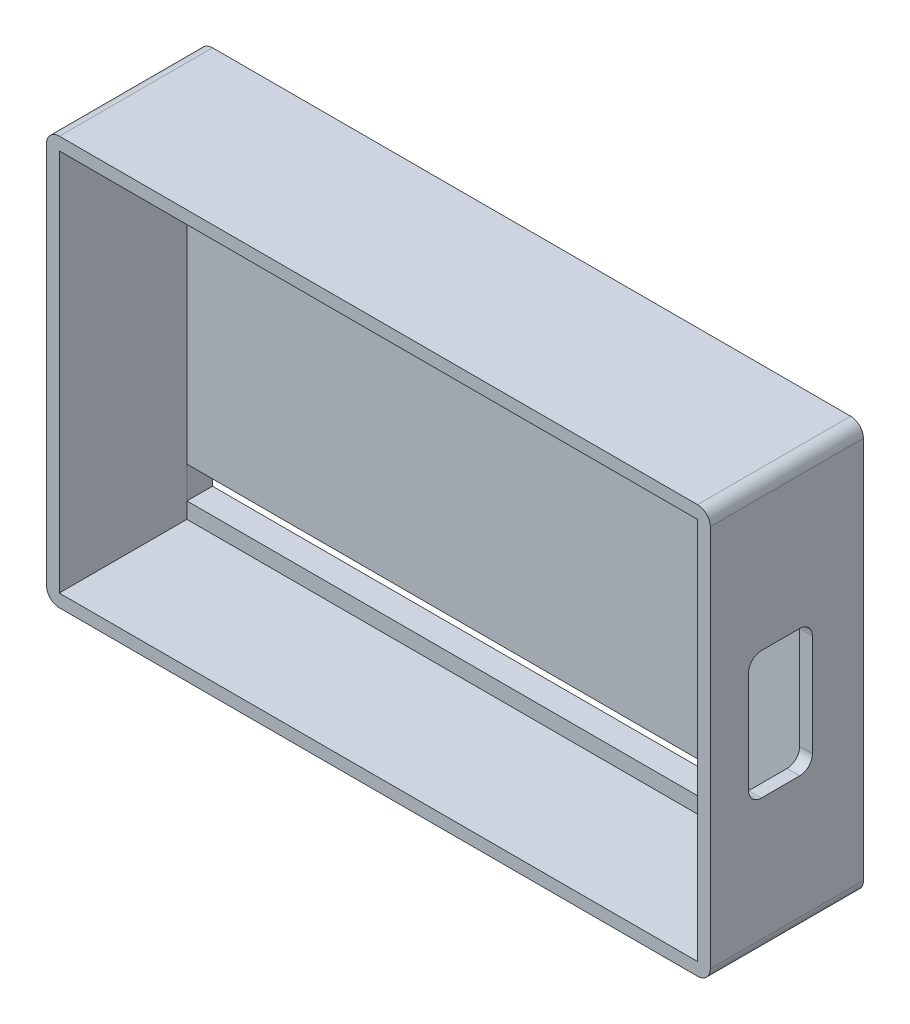
ISO-10303-21;
HEADER;
FILE_DESCRIPTION(('STEP AP214'),'2;1');
FILE_NAME('part.step','',(''),(''),'','','');
FILE_SCHEMA(('AUTOMOTIVE_DESIGN { 1 0 10303 214 1 1 1 1 }'));
ENDSEC;
DATA;
#1=APPLICATION_CONTEXT('core data for automotive mechanical design processes');
#2=APPLICATION_PROTOCOL_DEFINITION('international standard','automotive_design',2000,#1);
#3=PRODUCT_CONTEXT('',#1,'mechanical');
#4=PRODUCT('Part','Part','',(#3));
#5=PRODUCT_RELATED_PRODUCT_CATEGORY('part','',(#4));
#6=PRODUCT_DEFINITION_FORMATION('','',#4);
#7=PRODUCT_DEFINITION_CONTEXT('part definition',#1,'design');
#8=PRODUCT_DEFINITION('design','',#6,#7);
#9=PRODUCT_DEFINITION_SHAPE('','',#8);
#10=(LENGTH_UNIT() NAMED_UNIT(*) SI_UNIT(.MILLI.,.METRE.));
#11=(NAMED_UNIT(*) PLANE_ANGLE_UNIT() SI_UNIT($,.RADIAN.));
#12=(NAMED_UNIT(*) SI_UNIT($,.STERADIAN.) SOLID_ANGLE_UNIT());
#13=UNCERTAINTY_MEASURE_WITH_UNIT(LENGTH_MEASURE(1.E-05),#10,'distance_accuracy_value','');
#14=(GEOMETRIC_REPRESENTATION_CONTEXT(3) GLOBAL_UNCERTAINTY_ASSIGNED_CONTEXT((#13)) GLOBAL_UNIT_ASSIGNED_CONTEXT((#10,
#11,#12)) REPRESENTATION_CONTEXT('',''));
#15=CARTESIAN_POINT('',(0.,0.,0.));
#16=DIRECTION('',(0.,0.,1.));
#17=DIRECTION('',(1.,0.,0.));
#18=AXIS2_PLACEMENT_3D('',#15,#16,#17);
#19=CARTESIAN_POINT('',(0.,0.,2.));
#20=DIRECTION('',(0.,0.,1.));
#21=DIRECTION('',(1.,0.,0.));
#22=AXIS2_PLACEMENT_3D('',#19,#20,#21);
#23=PLANE('',#22);
#24=DIRECTION('',(-1.,0.,0.));
#25=VECTOR('',#24,1.);
#26=CARTESIAN_POINT('',(-25.,-11.25,2.));
#27=LINE('',#26,#25);
#28=CARTESIAN_POINT('',(25.0022335799357,-11.25,2.));
#29=VERTEX_POINT('',#28);
#30=CARTESIAN_POINT('',(-25.0022335799357,-11.25,2.));
#31=VERTEX_POINT('',#30);
#32=EDGE_CURVE('E562',#29,#31,#27,.T.);
#33=ORIENTED_EDGE('',*,*,#32,.F.);
#34=DIRECTION('',(0.,1.,0.));
#35=VECTOR('',#34,1.);
#36=CARTESIAN_POINT('',(25.0039671598715,0.,2.));
#37=LINE('',#36,#35);
#38=CARTESIAN_POINT('',(25.0022335799357,11.25,2.));
#39=VERTEX_POINT('',#38);
#40=EDGE_CURVE('E357',#29,#39,#37,.T.);
#41=ORIENTED_EDGE('',*,*,#40,.T.);
#42=DIRECTION('',(1.,0.,0.));
#43=VECTOR('',#42,1.);
#44=CARTESIAN_POINT('',(-25.,11.25,2.));
#45=LINE('',#44,#43);
#46=CARTESIAN_POINT('',(-25.0022335799357,11.25,2.));
#47=VERTEX_POINT('',#46);
#48=EDGE_CURVE('E523',#47,#39,#45,.T.);
#49=ORIENTED_EDGE('',*,*,#48,.F.);
#50=DIRECTION('',(0.,1.,0.));
#51=VECTOR('',#50,1.);
#52=CARTESIAN_POINT('',(-25.0039671598715,0.,2.));
#53=LINE('',#52,#51);
#54=EDGE_CURVE('E338',#47,#31,#53,.F.);
#55=ORIENTED_EDGE('',*,*,#54,.T.);
#56=EDGE_LOOP('',(#33,#41,#49,#55));
#57=FACE_BOUND('',#56,.T.);
#58=ADVANCED_FACE('F44',(#57),#23,.T.);
#59=DIRECTION('',(-1.,0.,0.));
#60=VECTOR('',#59,1.);
#61=CARTESIAN_POINT('',(-25.,13.75,2.));
#62=LINE('',#61,#60);
#63=CARTESIAN_POINT('',(25.0022335799357,13.75,2.));
#64=VERTEX_POINT('',#63);
#65=CARTESIAN_POINT('',(-25.0022335799357,13.75,2.));
#66=VERTEX_POINT('',#65);
#67=EDGE_CURVE('E528',#64,#66,#62,.T.);
#68=ORIENTED_EDGE('',*,*,#67,.F.);
#69=DIRECTION('',(0.,1.,0.));
#70=VECTOR('',#69,1.);
#71=CARTESIAN_POINT('',(25.0039671598715,0.,2.));
#72=LINE('',#71,#70);
#73=CARTESIAN_POINT('',(25.0039671598715,15.,2.));
#74=VERTEX_POINT('',#73);
#75=EDGE_CURVE('E353',#64,#74,#72,.T.);
#76=ORIENTED_EDGE('',*,*,#75,.T.);
#77=DIRECTION('',(-1.,0.,0.));
#78=VECTOR('',#77,1.);
#79=CARTESIAN_POINT('',(-25.0039671598715,15.,2.));
#80=LINE('',#79,#78);
#81=CARTESIAN_POINT('',(-25.0039671598715,15.,2.));
#82=VERTEX_POINT('',#81);
#83=EDGE_CURVE('E248',#74,#82,#80,.T.);
#84=ORIENTED_EDGE('',*,*,#83,.T.);
#85=DIRECTION('',(0.,1.,0.));
#86=VECTOR('',#85,1.);
#87=CARTESIAN_POINT('',(-25.0039671598715,0.,2.));
#88=LINE('',#87,#86);
#89=EDGE_CURVE('E348',#82,#66,#88,.F.);
#90=ORIENTED_EDGE('',*,*,#89,.T.);
#91=EDGE_LOOP('',(#68,#76,#84,#90));
#92=FACE_BOUND('',#91,.T.);
#93=ADVANCED_FACE('F638',(#92),#23,.T.);
#94=DIRECTION('',(1.,0.,0.));
#95=VECTOR('',#94,1.);
#96=CARTESIAN_POINT('',(-25.0039671598715,-15.,2.));
#97=LINE('',#96,#95);
#98=CARTESIAN_POINT('',(-25.0039671598715,-15.,2.));
#99=VERTEX_POINT('',#98);
#100=CARTESIAN_POINT('',(25.0039671598715,-15.,2.));
#101=VERTEX_POINT('',#100);
#102=EDGE_CURVE('E243',#99,#101,#97,.T.);
#103=ORIENTED_EDGE('',*,*,#102,.T.);
#104=DIRECTION('',(0.,1.,0.));
#105=VECTOR('',#104,1.);
#106=CARTESIAN_POINT('',(25.0039671598715,0.,2.));
#107=LINE('',#106,#105);
#108=CARTESIAN_POINT('',(25.0022335799357,-13.75,2.));
#109=VERTEX_POINT('',#108);
#110=EDGE_CURVE('E364',#101,#109,#107,.T.);
#111=ORIENTED_EDGE('',*,*,#110,.T.);
#112=DIRECTION('',(1.,0.,0.));
#113=VECTOR('',#112,1.);
#114=CARTESIAN_POINT('',(-25.,-13.75,2.));
#115=LINE('',#114,#113);
#116=CARTESIAN_POINT('',(-25.0022335799357,-13.75,2.));
#117=VERTEX_POINT('',#116);
#118=EDGE_CURVE('E560',#117,#109,#115,.T.);
#119=ORIENTED_EDGE('',*,*,#118,.F.);
#120=DIRECTION('',(0.,1.,0.));
#121=VECTOR('',#120,1.);
#122=CARTESIAN_POINT('',(-25.0039671598715,0.,2.));
#123=LINE('',#122,#121);
#124=EDGE_CURVE('E337',#117,#99,#123,.F.);
#125=ORIENTED_EDGE('',*,*,#124,.T.);
#126=EDGE_LOOP('',(#103,#111,#119,#125));
#127=FACE_BOUND('',#126,.T.);
#128=ADVANCED_FACE('F596',(#127),#23,.T.);
#129=CARTESIAN_POINT('',(0.,0.,0.));
#130=DIRECTION('',(0.,0.,1.));
#131=DIRECTION('',(1.,0.,0.));
#132=AXIS2_PLACEMENT_3D('',#129,#130,#131);
#133=PLANE('',#132);
#134=DIRECTION('',(0.,1.,0.));
#135=VECTOR('',#134,1.);
#136=CARTESIAN_POINT('',(25.,13.75,0.));
#137=LINE('',#136,#135);
#138=CARTESIAN_POINT('',(25.,11.25,0.));
#139=VERTEX_POINT('',#138);
#140=CARTESIAN_POINT('',(25.,13.75,0.));
#141=VERTEX_POINT('',#140);
#142=EDGE_CURVE('E547',#139,#141,#137,.T.);
#143=ORIENTED_EDGE('',*,*,#142,.T.);
#144=DIRECTION('',(-1.,0.,0.));
#145=VECTOR('',#144,1.);
#146=CARTESIAN_POINT('',(-25.,13.75,0.));
#147=LINE('',#146,#145);
#148=CARTESIAN_POINT('',(-25.,13.75,0.));
#149=VERTEX_POINT('',#148);
#150=EDGE_CURVE('E542',#141,#149,#147,.T.);
#151=ORIENTED_EDGE('',*,*,#150,.T.);
#152=DIRECTION('',(0.,-1.,0.));
#153=VECTOR('',#152,1.);
#154=CARTESIAN_POINT('',(-25.,13.75,0.));
#155=LINE('',#154,#153);
#156=CARTESIAN_POINT('',(-25.,11.25,0.));
#157=VERTEX_POINT('',#156);
#158=EDGE_CURVE('E536',#149,#157,#155,.T.);
#159=ORIENTED_EDGE('',*,*,#158,.T.);
#160=DIRECTION('',(1.,0.,0.));
#161=VECTOR('',#160,1.);
#162=CARTESIAN_POINT('',(-25.,11.25,0.));
#163=LINE('',#162,#161);
#164=EDGE_CURVE('E537',#157,#139,#163,.T.);
#165=ORIENTED_EDGE('',*,*,#164,.T.);
#166=EDGE_LOOP('',(#143,#151,#159,#165));
#167=FACE_BOUND('',#166,.T.);
#168=DIRECTION('',(0.,-1.,0.));
#169=VECTOR('',#168,1.);
#170=CARTESIAN_POINT('',(-26.,16.,0.));
#171=LINE('',#170,#169);
#172=CARTESIAN_POINT('',(-26.,15.,0.));
#173=VERTEX_POINT('',#172);
#174=CARTESIAN_POINT('',(-26.,-15.,0.));
#175=VERTEX_POINT('',#174);
#176=EDGE_CURVE('E500',#173,#175,#171,.T.);
#177=ORIENTED_EDGE('',*,*,#176,.F.);
#178=CARTESIAN_POINT('',(-25.,15.,0.));
#179=DIRECTION('',(0.,0.,1.));
#180=DIRECTION('',(1.,0.,0.));
#181=AXIS2_PLACEMENT_3D('',#178,#179,#180);
#182=CIRCLE('',#181,1.);
#183=CARTESIAN_POINT('',(-25.,16.,0.));
#184=VERTEX_POINT('',#183);
#185=EDGE_CURVE('E440',#173,#184,#182,.F.);
#186=ORIENTED_EDGE('',*,*,#185,.T.);
#187=DIRECTION('',(-1.,0.,0.));
#188=VECTOR('',#187,1.);
#189=CARTESIAN_POINT('',(-26.,16.,0.));
#190=LINE('',#189,#188);
#191=CARTESIAN_POINT('',(25.,16.,0.));
#192=VERTEX_POINT('',#191);
#193=EDGE_CURVE('E499',#192,#184,#190,.T.);
#194=ORIENTED_EDGE('',*,*,#193,.F.);
#195=CARTESIAN_POINT('',(25.,15.,0.));
#196=DIRECTION('',(0.,0.,1.));
#197=DIRECTION('',(1.,0.,0.));
#198=AXIS2_PLACEMENT_3D('',#195,#196,#197);
#199=CIRCLE('',#198,1.);
#200=CARTESIAN_POINT('',(26.,15.,0.));
#201=VERTEX_POINT('',#200);
#202=EDGE_CURVE('E394',#192,#201,#199,.F.);
#203=ORIENTED_EDGE('',*,*,#202,.T.);
#204=DIRECTION('',(0.,1.,0.));
#205=VECTOR('',#204,1.);
#206=CARTESIAN_POINT('',(26.,16.,0.));
#207=LINE('',#206,#205);
#208=CARTESIAN_POINT('',(26.,-15.,0.));
#209=VERTEX_POINT('',#208);
#210=EDGE_CURVE('E502',#209,#201,#207,.T.);
#211=ORIENTED_EDGE('',*,*,#210,.F.);
#212=CARTESIAN_POINT('',(25.,-15.,0.));
#213=DIRECTION('',(0.,0.,1.));
#214=DIRECTION('',(1.,0.,0.));
#215=AXIS2_PLACEMENT_3D('',#212,#213,#214);
#216=CIRCLE('',#215,1.);
#217=CARTESIAN_POINT('',(25.,-16.,0.));
#218=VERTEX_POINT('',#217);
#219=EDGE_CURVE('E410',#209,#218,#216,.F.);
#220=ORIENTED_EDGE('',*,*,#219,.T.);
#221=DIRECTION('',(1.,0.,0.));
#222=VECTOR('',#221,1.);
#223=CARTESIAN_POINT('',(-26.,-16.,0.));
#224=LINE('',#223,#222);
#225=CARTESIAN_POINT('',(-25.,-16.,0.));
#226=VERTEX_POINT('',#225);
#227=EDGE_CURVE('E376',#226,#218,#224,.T.);
#228=ORIENTED_EDGE('',*,*,#227,.F.);
#229=CARTESIAN_POINT('',(-25.,-15.,0.));
#230=DIRECTION('',(0.,0.,1.));
#231=DIRECTION('',(1.,0.,0.));
#232=AXIS2_PLACEMENT_3D('',#229,#230,#231);
#233=CIRCLE('',#232,1.);
#234=EDGE_CURVE('E422',#226,#175,#233,.F.);
#235=ORIENTED_EDGE('',*,*,#234,.T.);
#236=EDGE_LOOP('',(#177,#186,#194,#203,#211,#220,#228,#235));
#237=FACE_BOUND('',#236,.T.);
#238=DIRECTION('',(0.,1.,0.));
#239=VECTOR('',#238,1.);
#240=CARTESIAN_POINT('',(25.,-11.25,0.));
#241=LINE('',#240,#239);
#242=CARTESIAN_POINT('',(25.,-13.75,0.));
#243=VERTEX_POINT('',#242);
#244=CARTESIAN_POINT('',(25.,-11.25,0.));
#245=VERTEX_POINT('',#244);
#246=EDGE_CURVE('E276',#243,#245,#241,.T.);
#247=ORIENTED_EDGE('',*,*,#246,.T.);
#248=DIRECTION('',(-1.,0.,0.));
#249=VECTOR('',#248,1.);
#250=CARTESIAN_POINT('',(-25.,-11.25,0.));
#251=LINE('',#250,#249);
#252=CARTESIAN_POINT('',(-25.,-11.25,0.));
#253=VERTEX_POINT('',#252);
#254=EDGE_CURVE('E579',#245,#253,#251,.T.);
#255=ORIENTED_EDGE('',*,*,#254,.T.);
#256=DIRECTION('',(0.,-1.,0.));
#257=VECTOR('',#256,1.);
#258=CARTESIAN_POINT('',(-25.,-11.25,0.));
#259=LINE('',#258,#257);
#260=CARTESIAN_POINT('',(-25.,-13.75,0.));
#261=VERTEX_POINT('',#260);
#262=EDGE_CURVE('E573',#253,#261,#259,.T.);
#263=ORIENTED_EDGE('',*,*,#262,.T.);
#264=DIRECTION('',(1.,0.,0.));
#265=VECTOR('',#264,1.);
#266=CARTESIAN_POINT('',(-25.,-13.75,0.));
#267=LINE('',#266,#265);
#268=EDGE_CURVE('E571',#261,#243,#267,.T.);
#269=ORIENTED_EDGE('',*,*,#268,.T.);
#270=EDGE_LOOP('',(#247,#255,#263,#269));
#271=FACE_BOUND('',#270,.T.);
#272=ADVANCED_FACE('F648',(#167,#237,#271),#133,.F.);
#273=CARTESIAN_POINT('',(26.,16.,2.));
#274=DIRECTION('',(-1.,0.,0.));
#275=DIRECTION('',(0.,0.,1.));
#276=AXIS2_PLACEMENT_3D('',#273,#274,#275);
#277=PLANE('',#276);
#278=DIRECTION('',(0.,0.,1.));
#279=VECTOR('',#278,1.);
#280=CARTESIAN_POINT('',(26.,4.59367110958419,9.));
#281=LINE('',#280,#279);
#282=CARTESIAN_POINT('',(26.,4.59367110958419,5.));
#283=VERTEX_POINT('',#282);
#284=CARTESIAN_POINT('',(26.,4.59367110958419,8.));
#285=VERTEX_POINT('',#284);
#286=EDGE_CURVE('E724',#283,#285,#281,.T.);
#287=ORIENTED_EDGE('',*,*,#286,.F.);
#288=CARTESIAN_POINT('',(26.,3.59367110958419,5.));
#289=DIRECTION('',(-1.,0.,0.));
#290=DIRECTION('',(0.,0.,1.));
#291=AXIS2_PLACEMENT_3D('',#288,#289,#290);
#292=CIRCLE('',#291,1.);
#293=CARTESIAN_POINT('',(26.,3.59367110958419,4.));
#294=VERTEX_POINT('',#293);
#295=EDGE_CURVE('E454',#283,#294,#292,.T.);
#296=ORIENTED_EDGE('',*,*,#295,.T.);
#297=DIRECTION('',(0.,1.,0.));
#298=VECTOR('',#297,1.);
#299=CARTESIAN_POINT('',(26.,4.59367110958419,4.));
#300=LINE('',#299,#298);
#301=CARTESIAN_POINT('',(26.,-4.40632889041581,4.));
#302=VERTEX_POINT('',#301);
#303=EDGE_CURVE('E718',#302,#294,#300,.T.);
#304=ORIENTED_EDGE('',*,*,#303,.F.);
#305=CARTESIAN_POINT('',(26.,-4.40632889041581,5.));
#306=DIRECTION('',(-1.,0.,0.));
#307=DIRECTION('',(0.,0.,1.));
#308=AXIS2_PLACEMENT_3D('',#305,#306,#307);
#309=CIRCLE('',#308,1.);
#310=CARTESIAN_POINT('',(26.,-5.40632889041581,5.));
#311=VERTEX_POINT('',#310);
#312=EDGE_CURVE('E466',#302,#311,#309,.T.);
#313=ORIENTED_EDGE('',*,*,#312,.T.);
#314=DIRECTION('',(0.,0.,-1.));
#315=VECTOR('',#314,1.);
#316=CARTESIAN_POINT('',(26.,-5.40632889041581,9.));
#317=LINE('',#316,#315);
#318=CARTESIAN_POINT('',(26.,-5.40632889041581,8.));
#319=VERTEX_POINT('',#318);
#320=EDGE_CURVE('E356',#319,#311,#317,.T.);
#321=ORIENTED_EDGE('',*,*,#320,.F.);
#322=CARTESIAN_POINT('',(26.,-4.40632889041581,8.));
#323=DIRECTION('',(-1.,0.,0.));
#324=DIRECTION('',(0.,0.,1.));
#325=AXIS2_PLACEMENT_3D('',#322,#323,#324);
#326=CIRCLE('',#325,1.);
#327=CARTESIAN_POINT('',(26.,-4.40632889041581,9.));
#328=VERTEX_POINT('',#327);
#329=EDGE_CURVE('E482',#319,#328,#326,.T.);
#330=ORIENTED_EDGE('',*,*,#329,.T.);
#331=DIRECTION('',(0.,-1.,0.));
#332=VECTOR('',#331,1.);
#333=CARTESIAN_POINT('',(26.,4.59367110958419,9.));
#334=LINE('',#333,#332);
#335=CARTESIAN_POINT('',(26.,3.59367110958419,9.));
#336=VERTEX_POINT('',#335);
#337=EDGE_CURVE('E716',#336,#328,#334,.T.);
#338=ORIENTED_EDGE('',*,*,#337,.F.);
#339=CARTESIAN_POINT('',(26.,3.59367110958419,8.));
#340=DIRECTION('',(-1.,0.,0.));
#341=DIRECTION('',(0.,0.,1.));
#342=AXIS2_PLACEMENT_3D('',#339,#340,#341);
#343=CIRCLE('',#342,1.);
#344=EDGE_CURVE('E53',#336,#285,#343,.T.);
#345=ORIENTED_EDGE('',*,*,#344,.T.);
#346=EDGE_LOOP('',(#287,#296,#304,#313,#321,#330,#338,#345));
#347=FACE_BOUND('',#346,.T.);
#348=DIRECTION('',(0.,1.,0.));
#349=VECTOR('',#348,1.);
#350=CARTESIAN_POINT('',(26.,16.,12.));
#351=LINE('',#350,#349);
#352=CARTESIAN_POINT('',(26.,-15.,12.));
#353=VERTEX_POINT('',#352);
#354=CARTESIAN_POINT('',(26.,15.,12.));
#355=VERTEX_POINT('',#354);
#356=EDGE_CURVE('E252',#353,#355,#351,.T.);
#357=ORIENTED_EDGE('',*,*,#356,.F.);
#358=DIRECTION('',(0.,0.,-1.));
#359=VECTOR('',#358,1.);
#360=CARTESIAN_POINT('',(26.,-15.,2.));
#361=LINE('',#360,#359);
#362=EDGE_CURVE('E401',#353,#209,#361,.T.);
#363=ORIENTED_EDGE('',*,*,#362,.T.);
#364=ORIENTED_EDGE('',*,*,#210,.T.);
#365=DIRECTION('',(0.,0.,-1.));
#366=VECTOR('',#365,1.);
#367=CARTESIAN_POINT('',(26.,15.,2.));
#368=LINE('',#367,#366);
#369=EDGE_CURVE('E396',#201,#355,#368,.F.);
#370=ORIENTED_EDGE('',*,*,#369,.T.);
#371=EDGE_LOOP('',(#357,#363,#364,#370));
#372=FACE_BOUND('',#371,.T.);
#373=ADVANCED_FACE('F651',(#347,#372),#277,.F.);
#374=CARTESIAN_POINT('',(-26.,16.,2.));
#375=DIRECTION('',(0.,-1.,0.));
#376=DIRECTION('',(0.,0.,-1.));
#377=AXIS2_PLACEMENT_3D('',#374,#375,#376);
#378=PLANE('',#377);
#379=ORIENTED_EDGE('',*,*,#193,.T.);
#380=DIRECTION('',(0.,0.,-1.));
#381=VECTOR('',#380,1.);
#382=CARTESIAN_POINT('',(-25.,16.,2.));
#383=LINE('',#382,#381);
#384=CARTESIAN_POINT('',(-25.,16.,12.));
#385=VERTEX_POINT('',#384);
#386=EDGE_CURVE('E439',#184,#385,#383,.F.);
#387=ORIENTED_EDGE('',*,*,#386,.T.);
#388=DIRECTION('',(-1.,0.,0.));
#389=VECTOR('',#388,1.);
#390=CARTESIAN_POINT('',(-26.,16.,12.));
#391=LINE('',#390,#389);
#392=CARTESIAN_POINT('',(25.,16.,12.));
#393=VERTEX_POINT('',#392);
#394=EDGE_CURVE('E268',#393,#385,#391,.T.);
#395=ORIENTED_EDGE('',*,*,#394,.F.);
#396=DIRECTION('',(0.,0.,-1.));
#397=VECTOR('',#396,1.);
#398=CARTESIAN_POINT('',(25.,16.,2.));
#399=LINE('',#398,#397);
#400=EDGE_CURVE('E389',#393,#192,#399,.T.);
#401=ORIENTED_EDGE('',*,*,#400,.T.);
#402=EDGE_LOOP('',(#379,#387,#395,#401));
#403=FACE_BOUND('',#402,.T.);
#404=ADVANCED_FACE('F665',(#403),#378,.F.);
#405=CARTESIAN_POINT('',(-26.,16.,2.));
#406=DIRECTION('',(1.,0.,0.));
#407=DIRECTION('',(0.,0.,-1.));
#408=AXIS2_PLACEMENT_3D('',#405,#406,#407);
#409=PLANE('',#408);
#410=DIRECTION('',(0.,-1.,0.));
#411=VECTOR('',#410,1.);
#412=CARTESIAN_POINT('',(-26.,16.,12.));
#413=LINE('',#412,#411);
#414=CARTESIAN_POINT('',(-26.,15.,12.));
#415=VERTEX_POINT('',#414);
#416=CARTESIAN_POINT('',(-26.,-15.,12.));
#417=VERTEX_POINT('',#416);
#418=EDGE_CURVE('E271',#415,#417,#413,.T.);
#419=ORIENTED_EDGE('',*,*,#418,.F.);
#420=DIRECTION('',(0.,0.,-1.));
#421=VECTOR('',#420,1.);
#422=CARTESIAN_POINT('',(-26.,15.,2.));
#423=LINE('',#422,#421);
#424=EDGE_CURVE('E433',#415,#173,#423,.T.);
#425=ORIENTED_EDGE('',*,*,#424,.T.);
#426=ORIENTED_EDGE('',*,*,#176,.T.);
#427=DIRECTION('',(0.,0.,-1.));
#428=VECTOR('',#427,1.);
#429=CARTESIAN_POINT('',(-26.,-15.,2.));
#430=LINE('',#429,#428);
#431=EDGE_CURVE('E428',#175,#417,#430,.F.);
#432=ORIENTED_EDGE('',*,*,#431,.T.);
#433=EDGE_LOOP('',(#419,#425,#426,#432));
#434=FACE_BOUND('',#433,.T.);
#435=ADVANCED_FACE('F668',(#434),#409,.F.);
#436=CARTESIAN_POINT('',(-26.,-16.,2.));
#437=DIRECTION('',(0.,1.,0.));
#438=DIRECTION('',(0.,0.,1.));
#439=AXIS2_PLACEMENT_3D('',#436,#437,#438);
#440=PLANE('',#439);
#441=DIRECTION('',(1.,0.,0.));
#442=VECTOR('',#441,1.);
#443=CARTESIAN_POINT('',(-26.,-16.,12.));
#444=LINE('',#443,#442);
#445=CARTESIAN_POINT('',(-25.,-16.,12.));
#446=VERTEX_POINT('',#445);
#447=CARTESIAN_POINT('',(25.,-16.,12.));
#448=VERTEX_POINT('',#447);
#449=EDGE_CURVE('E277',#446,#448,#444,.T.);
#450=ORIENTED_EDGE('',*,*,#449,.F.);
#451=DIRECTION('',(0.,0.,-1.));
#452=VECTOR('',#451,1.);
#453=CARTESIAN_POINT('',(-25.,-16.,2.));
#454=LINE('',#453,#452);
#455=EDGE_CURVE('E419',#446,#226,#454,.T.);
#456=ORIENTED_EDGE('',*,*,#455,.T.);
#457=ORIENTED_EDGE('',*,*,#227,.T.);
#458=DIRECTION('',(0.,0.,-1.));
#459=VECTOR('',#458,1.);
#460=CARTESIAN_POINT('',(25.,-16.,2.));
#461=LINE('',#460,#459);
#462=EDGE_CURVE('E413',#218,#448,#461,.F.);
#463=ORIENTED_EDGE('',*,*,#462,.T.);
#464=EDGE_LOOP('',(#450,#456,#457,#463));
#465=FACE_BOUND('',#464,.T.);
#466=ADVANCED_FACE('F667',(#465),#440,.F.);
#467=CARTESIAN_POINT('',(25.,13.75,2.));
#468=DIRECTION('',(-1.,0.,0.));
#469=DIRECTION('',(0.,0.,1.));
#470=AXIS2_PLACEMENT_3D('',#467,#468,#469);
#471=PLANE('',#470);
#472=ORIENTED_EDGE('',*,*,#142,.F.);
#473=DIRECTION('',(0.,0.,-1.));
#474=VECTOR('',#473,1.);
#475=CARTESIAN_POINT('',(25.,11.25,2.));
#476=LINE('',#475,#474);
#477=EDGE_CURVE('E520',#39,#139,#476,.T.);
#478=ORIENTED_EDGE('',*,*,#477,.F.);
#479=CARTESIAN_POINT('',(25.,11.25,2.));
#480=DIRECTION('',(0.,1.,0.));
#481=VECTOR('',#480,1.);
#482=LINE('',#479,#481);
#483=EDGE_CURVE('E535',#39,#64,#482,.T.);
#484=ORIENTED_EDGE('',*,*,#483,.T.);
#485=DIRECTION('',(0.,0.,-1.));
#486=VECTOR('',#485,1.);
#487=CARTESIAN_POINT('',(25.,13.75,2.));
#488=LINE('',#487,#486);
#489=EDGE_CURVE('E510',#64,#141,#488,.T.);
#490=ORIENTED_EDGE('',*,*,#489,.T.);
#491=EDGE_LOOP('',(#472,#478,#484,#490));
#492=FACE_BOUND('',#491,.T.);
#493=ADVANCED_FACE('F666',(#492),#471,.T.);
#494=CARTESIAN_POINT('',(-25.,13.75,2.));
#495=DIRECTION('',(0.,-1.,0.));
#496=DIRECTION('',(0.,0.,-1.));
#497=AXIS2_PLACEMENT_3D('',#494,#495,#496);
#498=PLANE('',#497);
#499=ORIENTED_EDGE('',*,*,#150,.F.);
#500=ORIENTED_EDGE('',*,*,#489,.F.);
#501=ORIENTED_EDGE('',*,*,#67,.T.);
#502=DIRECTION('',(0.,0.,-1.));
#503=VECTOR('',#502,1.);
#504=CARTESIAN_POINT('',(-25.,13.75,2.));
#505=LINE('',#504,#503);
#506=EDGE_CURVE('E512',#66,#149,#505,.T.);
#507=ORIENTED_EDGE('',*,*,#506,.T.);
#508=EDGE_LOOP('',(#499,#500,#501,#507));
#509=FACE_BOUND('',#508,.T.);
#510=ADVANCED_FACE('F810',(#509),#498,.T.);
#511=CARTESIAN_POINT('',(-25.,13.75,2.));
#512=DIRECTION('',(1.,0.,0.));
#513=DIRECTION('',(0.,1.,0.));
#514=AXIS2_PLACEMENT_3D('',#511,#512,#513);
#515=PLANE('',#514);
#516=ORIENTED_EDGE('',*,*,#158,.F.);
#517=ORIENTED_EDGE('',*,*,#506,.F.);
#518=CARTESIAN_POINT('',(-25.,13.75,2.));
#519=DIRECTION('',(0.,-1.,0.));
#520=VECTOR('',#519,1.);
#521=LINE('',#518,#520);
#522=EDGE_CURVE('E521',#66,#47,#521,.T.);
#523=ORIENTED_EDGE('',*,*,#522,.T.);
#524=DIRECTION('',(0.,0.,-1.));
#525=VECTOR('',#524,1.);
#526=CARTESIAN_POINT('',(-25.,11.25,2.));
#527=LINE('',#526,#525);
#528=EDGE_CURVE('E511',#47,#157,#527,.T.);
#529=ORIENTED_EDGE('',*,*,#528,.T.);
#530=EDGE_LOOP('',(#516,#517,#523,#529));
#531=FACE_BOUND('',#530,.T.);
#532=ADVANCED_FACE('F775',(#531),#515,.T.);
#533=CARTESIAN_POINT('',(-25.,11.25,2.));
#534=DIRECTION('',(0.,1.,0.));
#535=DIRECTION('',(0.,0.,1.));
#536=AXIS2_PLACEMENT_3D('',#533,#534,#535);
#537=PLANE('',#536);
#538=ORIENTED_EDGE('',*,*,#164,.F.);
#539=ORIENTED_EDGE('',*,*,#528,.F.);
#540=ORIENTED_EDGE('',*,*,#48,.T.);
#541=ORIENTED_EDGE('',*,*,#477,.T.);
#542=EDGE_LOOP('',(#538,#539,#540,#541));
#543=FACE_BOUND('',#542,.T.);
#544=ADVANCED_FACE('F767',(#543),#537,.T.);
#545=CARTESIAN_POINT('',(25.,-11.25,2.));
#546=DIRECTION('',(-1.,0.,0.));
#547=DIRECTION('',(0.,-1.,0.));
#548=AXIS2_PLACEMENT_3D('',#545,#546,#547);
#549=PLANE('',#548);
#550=ORIENTED_EDGE('',*,*,#246,.F.);
#551=DIRECTION('',(0.,0.,-1.));
#552=VECTOR('',#551,1.);
#553=CARTESIAN_POINT('',(25.,-13.75,2.));
#554=LINE('',#553,#552);
#555=EDGE_CURVE('E334',#109,#243,#554,.T.);
#556=ORIENTED_EDGE('',*,*,#555,.F.);
#557=CARTESIAN_POINT('',(25.,-13.75,2.));
#558=DIRECTION('',(0.,1.,0.));
#559=VECTOR('',#558,1.);
#560=LINE('',#557,#559);
#561=EDGE_CURVE('E570',#109,#29,#560,.T.);
#562=ORIENTED_EDGE('',*,*,#561,.T.);
#563=DIRECTION('',(0.,0.,-1.));
#564=VECTOR('',#563,1.);
#565=CARTESIAN_POINT('',(25.,-11.25,2.));
#566=LINE('',#565,#564);
#567=EDGE_CURVE('E329',#29,#245,#566,.T.);
#568=ORIENTED_EDGE('',*,*,#567,.T.);
#569=EDGE_LOOP('',(#550,#556,#562,#568));
#570=FACE_BOUND('',#569,.T.);
#571=ADVANCED_FACE('F754',(#570),#549,.T.);
#572=CARTESIAN_POINT('',(-25.,-11.25,2.));
#573=DIRECTION('',(0.,-1.,0.));
#574=DIRECTION('',(0.,0.,-1.));
#575=AXIS2_PLACEMENT_3D('',#572,#573,#574);
#576=PLANE('',#575);
#577=ORIENTED_EDGE('',*,*,#254,.F.);
#578=ORIENTED_EDGE('',*,*,#567,.F.);
#579=ORIENTED_EDGE('',*,*,#32,.T.);
#580=DIRECTION('',(0.,0.,-1.));
#581=VECTOR('',#580,1.);
#582=CARTESIAN_POINT('',(-25.,-11.25,2.));
#583=LINE('',#582,#581);
#584=EDGE_CURVE('E316',#31,#253,#583,.T.);
#585=ORIENTED_EDGE('',*,*,#584,.T.);
#586=EDGE_LOOP('',(#577,#578,#579,#585));
#587=FACE_BOUND('',#586,.T.);
#588=ADVANCED_FACE('F307',(#587),#576,.T.);
#589=CARTESIAN_POINT('',(-25.,-11.25,2.));
#590=DIRECTION('',(1.,0.,0.));
#591=DIRECTION('',(0.,0.,-1.));
#592=AXIS2_PLACEMENT_3D('',#589,#590,#591);
#593=PLANE('',#592);
#594=ORIENTED_EDGE('',*,*,#262,.F.);
#595=ORIENTED_EDGE('',*,*,#584,.F.);
#596=CARTESIAN_POINT('',(-25.,-11.25,2.));
#597=DIRECTION('',(0.,-1.,0.));
#598=VECTOR('',#597,1.);
#599=LINE('',#596,#598);
#600=EDGE_CURVE('E561',#31,#117,#599,.T.);
#601=ORIENTED_EDGE('',*,*,#600,.T.);
#602=DIRECTION('',(0.,0.,-1.));
#603=VECTOR('',#602,1.);
#604=CARTESIAN_POINT('',(-25.,-13.75,2.));
#605=LINE('',#604,#603);
#606=EDGE_CURVE('E327',#117,#261,#605,.T.);
#607=ORIENTED_EDGE('',*,*,#606,.T.);
#608=EDGE_LOOP('',(#594,#595,#601,#607));
#609=FACE_BOUND('',#608,.T.);
#610=ADVANCED_FACE('F302',(#609),#593,.T.);
#611=CARTESIAN_POINT('',(-25.,-13.75,2.));
#612=DIRECTION('',(0.,1.,0.));
#613=DIRECTION('',(0.,0.,1.));
#614=AXIS2_PLACEMENT_3D('',#611,#612,#613);
#615=PLANE('',#614);
#616=ORIENTED_EDGE('',*,*,#268,.F.);
#617=ORIENTED_EDGE('',*,*,#606,.F.);
#618=ORIENTED_EDGE('',*,*,#118,.T.);
#619=ORIENTED_EDGE('',*,*,#555,.T.);
#620=EDGE_LOOP('',(#616,#617,#618,#619));
#621=FACE_BOUND('',#620,.T.);
#622=ADVANCED_FACE('F297',(#621),#615,.T.);
#623=CARTESIAN_POINT('',(0.,0.,12.));
#624=DIRECTION('',(0.,0.,1.));
#625=DIRECTION('',(1.,0.,0.));
#626=AXIS2_PLACEMENT_3D('',#623,#624,#625);
#627=PLANE('',#626);
#628=ORIENTED_EDGE('',*,*,#394,.T.);
#629=CARTESIAN_POINT('',(-25.,15.,12.));
#630=DIRECTION('',(0.,0.,1.));
#631=DIRECTION('',(1.,0.,0.));
#632=AXIS2_PLACEMENT_3D('',#629,#630,#631);
#633=CIRCLE('',#632,1.);
#634=EDGE_CURVE('E442',#385,#415,#633,.T.);
#635=ORIENTED_EDGE('',*,*,#634,.T.);
#636=ORIENTED_EDGE('',*,*,#418,.T.);
#637=CARTESIAN_POINT('',(-25.,-15.,12.));
#638=DIRECTION('',(0.,0.,1.));
#639=DIRECTION('',(1.,0.,0.));
#640=AXIS2_PLACEMENT_3D('',#637,#638,#639);
#641=CIRCLE('',#640,1.);
#642=EDGE_CURVE('E427',#417,#446,#641,.T.);
#643=ORIENTED_EDGE('',*,*,#642,.T.);
#644=ORIENTED_EDGE('',*,*,#449,.T.);
#645=CARTESIAN_POINT('',(25.,-15.,12.));
#646=DIRECTION('',(0.,0.,1.));
#647=DIRECTION('',(1.,0.,0.));
#648=AXIS2_PLACEMENT_3D('',#645,#646,#647);
#649=CIRCLE('',#648,1.);
#650=EDGE_CURVE('E411',#448,#353,#649,.T.);
#651=ORIENTED_EDGE('',*,*,#650,.T.);
#652=ORIENTED_EDGE('',*,*,#356,.T.);
#653=CARTESIAN_POINT('',(25.,15.,12.));
#654=DIRECTION('',(0.,0.,1.));
#655=DIRECTION('',(1.,0.,0.));
#656=AXIS2_PLACEMENT_3D('',#653,#654,#655);
#657=CIRCLE('',#656,1.);
#658=EDGE_CURVE('E400',#355,#393,#657,.T.);
#659=ORIENTED_EDGE('',*,*,#658,.T.);
#660=EDGE_LOOP('',(#628,#635,#636,#643,#644,#651,#652,#659));
#661=FACE_BOUND('',#660,.T.);
#662=DIRECTION('',(-1.,0.,0.));
#663=VECTOR('',#662,1.);
#664=CARTESIAN_POINT('',(-25.0039671598715,15.,12.));
#665=LINE('',#664,#663);
#666=CARTESIAN_POINT('',(25.0039671598715,15.,12.));
#667=VERTEX_POINT('',#666);
#668=CARTESIAN_POINT('',(-25.0039671598715,15.,12.));
#669=VERTEX_POINT('',#668);
#670=EDGE_CURVE('E245',#667,#669,#665,.T.);
#671=ORIENTED_EDGE('',*,*,#670,.F.);
#672=DIRECTION('',(0.,1.,0.));
#673=VECTOR('',#672,1.);
#674=CARTESIAN_POINT('',(25.0039671598715,15.,12.));
#675=LINE('',#674,#673);
#676=CARTESIAN_POINT('',(25.0039671598715,-15.,12.));
#677=VERTEX_POINT('',#676);
#678=EDGE_CURVE('E233',#677,#667,#675,.T.);
#679=ORIENTED_EDGE('',*,*,#678,.F.);
#680=DIRECTION('',(1.,0.,0.));
#681=VECTOR('',#680,1.);
#682=CARTESIAN_POINT('',(-25.0039671598715,-15.,12.));
#683=LINE('',#682,#681);
#684=CARTESIAN_POINT('',(-25.0039671598715,-15.,12.));
#685=VERTEX_POINT('',#684);
#686=EDGE_CURVE('E263',#685,#677,#683,.T.);
#687=ORIENTED_EDGE('',*,*,#686,.F.);
#688=DIRECTION('',(0.,-1.,0.));
#689=VECTOR('',#688,1.);
#690=CARTESIAN_POINT('',(-25.0039671598715,15.,12.));
#691=LINE('',#690,#689);
#692=EDGE_CURVE('E260',#669,#685,#691,.T.);
#693=ORIENTED_EDGE('',*,*,#692,.F.);
#694=EDGE_LOOP('',(#671,#679,#687,#693));
#695=FACE_BOUND('',#694,.T.);
#696=ADVANCED_FACE('F253',(#661,#695),#627,.T.);
#697=CARTESIAN_POINT('',(25.0039671598715,15.,12.));
#698=DIRECTION('',(-1.,0.,0.));
#699=DIRECTION('',(0.,0.,1.));
#700=AXIS2_PLACEMENT_3D('',#697,#698,#699);
#701=PLANE('',#700);
#702=DIRECTION('',(0.,-1.,0.));
#703=VECTOR('',#702,1.);
#704=CARTESIAN_POINT('',(25.0039671598715,15.,4.));
#705=LINE('',#704,#703);
#706=CARTESIAN_POINT('',(25.0039671598715,3.59367110958419,4.));
#707=VERTEX_POINT('',#706);
#708=CARTESIAN_POINT('',(25.0039671598715,-4.40632889041581,4.));
#709=VERTEX_POINT('',#708);
#710=EDGE_CURVE('E381',#707,#709,#705,.T.);
#711=ORIENTED_EDGE('',*,*,#710,.F.);
#712=CARTESIAN_POINT('',(25.0039671598715,3.59367110958419,5.));
#713=DIRECTION('',(-1.,0.,0.));
#714=DIRECTION('',(0.,0.,1.));
#715=AXIS2_PLACEMENT_3D('',#712,#713,#714);
#716=CIRCLE('',#715,1.);
#717=CARTESIAN_POINT('',(25.0039671598715,4.59367110958419,5.));
#718=VERTEX_POINT('',#717);
#719=EDGE_CURVE('E459',#707,#718,#716,.F.);
#720=ORIENTED_EDGE('',*,*,#719,.T.);
#721=DIRECTION('',(0.,0.,-1.));
#722=VECTOR('',#721,1.);
#723=CARTESIAN_POINT('',(25.0039671598715,4.59367110958419,12.));
#724=LINE('',#723,#722);
#725=CARTESIAN_POINT('',(25.0039671598715,4.59367110958419,8.));
#726=VERTEX_POINT('',#725);
#727=EDGE_CURVE('E375',#726,#718,#724,.T.);
#728=ORIENTED_EDGE('',*,*,#727,.F.);
#729=CARTESIAN_POINT('',(25.0039671598715,3.59367110958419,8.));
#730=DIRECTION('',(-1.,0.,0.));
#731=DIRECTION('',(0.,0.,1.));
#732=AXIS2_PLACEMENT_3D('',#729,#730,#731);
#733=CIRCLE('',#732,1.);
#734=CARTESIAN_POINT('',(25.0039671598715,3.59367110958419,9.));
#735=VERTEX_POINT('',#734);
#736=EDGE_CURVE('E11',#726,#735,#733,.F.);
#737=ORIENTED_EDGE('',*,*,#736,.T.);
#738=DIRECTION('',(0.,1.,0.));
#739=VECTOR('',#738,1.);
#740=CARTESIAN_POINT('',(25.0039671598715,15.,9.));
#741=LINE('',#740,#739);
#742=CARTESIAN_POINT('',(25.0039671598715,-4.40632889041581,9.));
#743=VERTEX_POINT('',#742);
#744=EDGE_CURVE('E374',#743,#735,#741,.T.);
#745=ORIENTED_EDGE('',*,*,#744,.F.);
#746=CARTESIAN_POINT('',(25.0039671598715,-4.40632889041581,8.));
#747=DIRECTION('',(-1.,0.,0.));
#748=DIRECTION('',(0.,0.,1.));
#749=AXIS2_PLACEMENT_3D('',#746,#747,#748);
#750=CIRCLE('',#749,1.);
#751=CARTESIAN_POINT('',(25.0039671598715,-5.40632889041581,8.));
#752=VERTEX_POINT('',#751);
#753=EDGE_CURVE('E488',#743,#752,#750,.F.);
#754=ORIENTED_EDGE('',*,*,#753,.T.);
#755=DIRECTION('',(0.,0.,1.));
#756=VECTOR('',#755,1.);
#757=CARTESIAN_POINT('',(25.0039671598715,-5.40632889041581,12.));
#758=LINE('',#757,#756);
#759=CARTESIAN_POINT('',(25.0039671598715,-5.40632889041581,5.));
#760=VERTEX_POINT('',#759);
#761=EDGE_CURVE('E379',#760,#752,#758,.T.);
#762=ORIENTED_EDGE('',*,*,#761,.F.);
#763=CARTESIAN_POINT('',(25.0039671598715,-4.40632889041581,5.));
#764=DIRECTION('',(-1.,0.,0.));
#765=DIRECTION('',(0.,0.,1.));
#766=AXIS2_PLACEMENT_3D('',#763,#764,#765);
#767=CIRCLE('',#766,1.);
#768=EDGE_CURVE('E475',#760,#709,#767,.F.);
#769=ORIENTED_EDGE('',*,*,#768,.T.);
#770=EDGE_LOOP('',(#711,#720,#728,#737,#745,#754,#762,#769));
#771=FACE_BOUND('',#770,.T.);
#772=ORIENTED_EDGE('',*,*,#110,.F.);
#773=DIRECTION('',(0.,0.,-1.));
#774=VECTOR('',#773,1.);
#775=CARTESIAN_POINT('',(25.0039671598715,-15.,12.));
#776=LINE('',#775,#774);
#777=EDGE_CURVE('E240',#677,#101,#776,.T.);
#778=ORIENTED_EDGE('',*,*,#777,.F.);
#779=ORIENTED_EDGE('',*,*,#678,.T.);
#780=DIRECTION('',(0.,0.,-1.));
#781=VECTOR('',#780,1.);
#782=CARTESIAN_POINT('',(25.0039671598715,15.,12.));
#783=LINE('',#782,#781);
#784=EDGE_CURVE('E232',#667,#74,#783,.T.);
#785=ORIENTED_EDGE('',*,*,#784,.T.);
#786=ORIENTED_EDGE('',*,*,#75,.F.);
#787=ORIENTED_EDGE('',*,*,#483,.F.);
#788=ORIENTED_EDGE('',*,*,#40,.F.);
#789=ORIENTED_EDGE('',*,*,#561,.F.);
#790=EDGE_LOOP('',(#772,#778,#779,#785,#786,#787,#788,#789));
#791=FACE_BOUND('',#790,.T.);
#792=ADVANCED_FACE('F234',(#771,#791),#701,.T.);
#793=CARTESIAN_POINT('',(-25.0039671598715,15.,12.));
#794=DIRECTION('',(0.,-1.,0.));
#795=DIRECTION('',(0.,0.,-1.));
#796=AXIS2_PLACEMENT_3D('',#793,#794,#795);
#797=PLANE('',#796);
#798=ORIENTED_EDGE('',*,*,#83,.F.);
#799=ORIENTED_EDGE('',*,*,#784,.F.);
#800=ORIENTED_EDGE('',*,*,#670,.T.);
#801=DIRECTION('',(0.,0.,-1.));
#802=VECTOR('',#801,1.);
#803=CARTESIAN_POINT('',(-25.0039671598715,15.,12.));
#804=LINE('',#803,#802);
#805=EDGE_CURVE('E255',#669,#82,#804,.T.);
#806=ORIENTED_EDGE('',*,*,#805,.T.);
#807=EDGE_LOOP('',(#798,#799,#800,#806));
#808=FACE_BOUND('',#807,.T.);
#809=ADVANCED_FACE('F246',(#808),#797,.T.);
#810=CARTESIAN_POINT('',(-25.0039671598715,15.,12.));
#811=DIRECTION('',(1.,0.,0.));
#812=DIRECTION('',(0.,0.,-1.));
#813=AXIS2_PLACEMENT_3D('',#810,#811,#812);
#814=PLANE('',#813);
#815=ORIENTED_EDGE('',*,*,#89,.F.);
#816=ORIENTED_EDGE('',*,*,#805,.F.);
#817=ORIENTED_EDGE('',*,*,#692,.T.);
#818=DIRECTION('',(0.,0.,-1.));
#819=VECTOR('',#818,1.);
#820=CARTESIAN_POINT('',(-25.0039671598715,-15.,12.));
#821=LINE('',#820,#819);
#822=EDGE_CURVE('E589',#685,#99,#821,.T.);
#823=ORIENTED_EDGE('',*,*,#822,.T.);
#824=ORIENTED_EDGE('',*,*,#124,.F.);
#825=ORIENTED_EDGE('',*,*,#600,.F.);
#826=ORIENTED_EDGE('',*,*,#54,.F.);
#827=ORIENTED_EDGE('',*,*,#522,.F.);
#828=EDGE_LOOP('',(#815,#816,#817,#823,#824,#825,#826,#827));
#829=FACE_BOUND('',#828,.T.);
#830=ADVANCED_FACE('F609',(#829),#814,.T.);
#831=CARTESIAN_POINT('',(-25.0039671598715,-15.,12.));
#832=DIRECTION('',(0.,1.,0.));
#833=DIRECTION('',(0.,0.,1.));
#834=AXIS2_PLACEMENT_3D('',#831,#832,#833);
#835=PLANE('',#834);
#836=ORIENTED_EDGE('',*,*,#102,.F.);
#837=ORIENTED_EDGE('',*,*,#822,.F.);
#838=ORIENTED_EDGE('',*,*,#686,.T.);
#839=ORIENTED_EDGE('',*,*,#777,.T.);
#840=EDGE_LOOP('',(#836,#837,#838,#839));
#841=FACE_BOUND('',#840,.T.);
#842=ADVANCED_FACE('F594',(#841),#835,.T.);
#843=CARTESIAN_POINT('',(16.,4.59367110958419,4.));
#844=DIRECTION('',(0.,0.,-1.));
#845=DIRECTION('',(0.,1.,0.));
#846=AXIS2_PLACEMENT_3D('',#843,#844,#845);
#847=PLANE('',#846);
#848=ORIENTED_EDGE('',*,*,#710,.T.);
#849=DIRECTION('',(1.,0.,0.));
#850=VECTOR('',#849,1.);
#851=CARTESIAN_POINT('',(26.,-4.40632889041581,4.));
#852=LINE('',#851,#850);
#853=EDGE_CURVE('E461',#709,#302,#852,.T.);
#854=ORIENTED_EDGE('',*,*,#853,.T.);
#855=ORIENTED_EDGE('',*,*,#303,.T.);
#856=DIRECTION('',(1.,0.,0.));
#857=VECTOR('',#856,1.);
#858=CARTESIAN_POINT('',(25.0039671598715,3.59367110958419,4.));
#859=LINE('',#858,#857);
#860=EDGE_CURVE('E448',#294,#707,#859,.F.);
#861=ORIENTED_EDGE('',*,*,#860,.T.);
#862=EDGE_LOOP('',(#848,#854,#855,#861));
#863=FACE_BOUND('',#862,.T.);
#864=ADVANCED_FACE('F620',(#863),#847,.F.);
#865=CARTESIAN_POINT('',(16.,-5.40632889041581,9.));
#866=DIRECTION('',(0.,-1.,0.));
#867=DIRECTION('',(0.,0.,-1.));
#868=AXIS2_PLACEMENT_3D('',#865,#866,#867);
#869=PLANE('',#868);
#870=ORIENTED_EDGE('',*,*,#761,.T.);
#871=DIRECTION('',(1.,0.,0.));
#872=VECTOR('',#871,1.);
#873=CARTESIAN_POINT('',(26.,-5.40632889041581,8.));
#874=LINE('',#873,#872);
#875=EDGE_CURVE('E473',#752,#319,#874,.T.);
#876=ORIENTED_EDGE('',*,*,#875,.T.);
#877=ORIENTED_EDGE('',*,*,#320,.T.);
#878=DIRECTION('',(1.,0.,0.));
#879=VECTOR('',#878,1.);
#880=CARTESIAN_POINT('',(25.0039671598715,-5.40632889041581,5.));
#881=LINE('',#880,#879);
#882=EDGE_CURVE('E465',#311,#760,#881,.F.);
#883=ORIENTED_EDGE('',*,*,#882,.T.);
#884=EDGE_LOOP('',(#870,#876,#877,#883));
#885=FACE_BOUND('',#884,.T.);
#886=ADVANCED_FACE('F625',(#885),#869,.F.);
#887=CARTESIAN_POINT('',(16.,4.59367110958419,9.));
#888=DIRECTION('',(0.,0.,1.));
#889=DIRECTION('',(0.,-1.,0.));
#890=AXIS2_PLACEMENT_3D('',#887,#888,#889);
#891=PLANE('',#890);
#892=ORIENTED_EDGE('',*,*,#744,.T.);
#893=DIRECTION('',(1.,0.,0.));
#894=VECTOR('',#893,1.);
#895=CARTESIAN_POINT('',(26.,3.59367110958419,9.));
#896=LINE('',#895,#894);
#897=EDGE_CURVE('E490',#735,#336,#896,.T.);
#898=ORIENTED_EDGE('',*,*,#897,.T.);
#899=ORIENTED_EDGE('',*,*,#337,.T.);
#900=DIRECTION('',(1.,0.,0.));
#901=VECTOR('',#900,1.);
#902=CARTESIAN_POINT('',(25.0039671598715,-4.40632889041581,9.));
#903=LINE('',#902,#901);
#904=EDGE_CURVE('E480',#328,#743,#903,.F.);
#905=ORIENTED_EDGE('',*,*,#904,.T.);
#906=EDGE_LOOP('',(#892,#898,#899,#905));
#907=FACE_BOUND('',#906,.T.);
#908=ADVANCED_FACE('F628',(#907),#891,.F.);
#909=CARTESIAN_POINT('',(16.,4.59367110958419,9.));
#910=DIRECTION('',(0.,1.,0.));
#911=DIRECTION('',(0.,0.,1.));
#912=AXIS2_PLACEMENT_3D('',#909,#910,#911);
#913=PLANE('',#912);
#914=ORIENTED_EDGE('',*,*,#286,.T.);
#915=DIRECTION('',(1.,0.,0.));
#916=VECTOR('',#915,1.);
#917=CARTESIAN_POINT('',(25.0039671598715,4.59367110958419,8.));
#918=LINE('',#917,#916);
#919=EDGE_CURVE('E69',#285,#726,#918,.F.);
#920=ORIENTED_EDGE('',*,*,#919,.T.);
#921=ORIENTED_EDGE('',*,*,#727,.T.);
#922=DIRECTION('',(1.,0.,0.));
#923=VECTOR('',#922,1.);
#924=CARTESIAN_POINT('',(26.,4.59367110958419,5.));
#925=LINE('',#924,#923);
#926=EDGE_CURVE('E447',#718,#283,#925,.T.);
#927=ORIENTED_EDGE('',*,*,#926,.T.);
#928=EDGE_LOOP('',(#914,#920,#921,#927));
#929=FACE_BOUND('',#928,.T.);
#930=ADVANCED_FACE('F624',(#929),#913,.F.);
#931=CARTESIAN_POINT('',(25.,15.,2.));
#932=DIRECTION('',(0.,0.,-1.));
#933=DIRECTION('',(-1.,0.,0.));
#934=AXIS2_PLACEMENT_3D('',#931,#932,#933);
#935=CYLINDRICAL_SURFACE('',#934,1.);
#936=ORIENTED_EDGE('',*,*,#658,.F.);
#937=ORIENTED_EDGE('',*,*,#369,.F.);
#938=ORIENTED_EDGE('',*,*,#202,.F.);
#939=ORIENTED_EDGE('',*,*,#400,.F.);
#940=EDGE_LOOP('',(#936,#937,#938,#939));
#941=FACE_BOUND('',#940,.T.);
#942=ADVANCED_FACE('F630',(#941),#935,.T.);
#943=CARTESIAN_POINT('',(25.,-15.,2.));
#944=DIRECTION('',(0.,0.,-1.));
#945=DIRECTION('',(-1.,0.,0.));
#946=AXIS2_PLACEMENT_3D('',#943,#944,#945);
#947=CYLINDRICAL_SURFACE('',#946,1.);
#948=ORIENTED_EDGE('',*,*,#650,.F.);
#949=ORIENTED_EDGE('',*,*,#462,.F.);
#950=ORIENTED_EDGE('',*,*,#219,.F.);
#951=ORIENTED_EDGE('',*,*,#362,.F.);
#952=EDGE_LOOP('',(#948,#949,#950,#951));
#953=FACE_BOUND('',#952,.T.);
#954=ADVANCED_FACE('F678',(#953),#947,.T.);
#955=CARTESIAN_POINT('',(-25.,-15.,2.));
#956=DIRECTION('',(0.,0.,-1.));
#957=DIRECTION('',(-1.,0.,0.));
#958=AXIS2_PLACEMENT_3D('',#955,#956,#957);
#959=CYLINDRICAL_SURFACE('',#958,1.);
#960=ORIENTED_EDGE('',*,*,#642,.F.);
#961=ORIENTED_EDGE('',*,*,#431,.F.);
#962=ORIENTED_EDGE('',*,*,#234,.F.);
#963=ORIENTED_EDGE('',*,*,#455,.F.);
#964=EDGE_LOOP('',(#960,#961,#962,#963));
#965=FACE_BOUND('',#964,.T.);
#966=ADVANCED_FACE('F681',(#965),#959,.T.);
#967=CARTESIAN_POINT('',(-25.,15.,2.));
#968=DIRECTION('',(0.,0.,-1.));
#969=DIRECTION('',(-1.,0.,0.));
#970=AXIS2_PLACEMENT_3D('',#967,#968,#969);
#971=CYLINDRICAL_SURFACE('',#970,1.);
#972=ORIENTED_EDGE('',*,*,#634,.F.);
#973=ORIENTED_EDGE('',*,*,#386,.F.);
#974=ORIENTED_EDGE('',*,*,#185,.F.);
#975=ORIENTED_EDGE('',*,*,#424,.F.);
#976=EDGE_LOOP('',(#972,#973,#974,#975));
#977=FACE_BOUND('',#976,.T.);
#978=ADVANCED_FACE('F688',(#977),#971,.T.);
#979=CARTESIAN_POINT('',(16.,3.59367110958419,5.));
#980=DIRECTION('',(-1.,0.,0.));
#981=DIRECTION('',(0.,0.,1.));
#982=AXIS2_PLACEMENT_3D('',#979,#980,#981);
#983=CYLINDRICAL_SURFACE('',#982,1.);
#984=ORIENTED_EDGE('',*,*,#719,.F.);
#985=ORIENTED_EDGE('',*,*,#860,.F.);
#986=ORIENTED_EDGE('',*,*,#295,.F.);
#987=ORIENTED_EDGE('',*,*,#926,.F.);
#988=EDGE_LOOP('',(#984,#985,#986,#987));
#989=FACE_BOUND('',#988,.T.);
#990=ADVANCED_FACE('F687',(#989),#983,.F.);
#991=CARTESIAN_POINT('',(16.,-4.40632889041581,5.));
#992=DIRECTION('',(-1.,0.,0.));
#993=DIRECTION('',(0.,0.,1.));
#994=AXIS2_PLACEMENT_3D('',#991,#992,#993);
#995=CYLINDRICAL_SURFACE('',#994,1.);
#996=ORIENTED_EDGE('',*,*,#768,.F.);
#997=ORIENTED_EDGE('',*,*,#882,.F.);
#998=ORIENTED_EDGE('',*,*,#312,.F.);
#999=ORIENTED_EDGE('',*,*,#853,.F.);
#1000=EDGE_LOOP('',(#996,#997,#998,#999));
#1001=FACE_BOUND('',#1000,.T.);
#1002=ADVANCED_FACE('F692',(#1001),#995,.F.);
#1003=CARTESIAN_POINT('',(16.,-4.40632889041581,8.));
#1004=DIRECTION('',(-1.,0.,0.));
#1005=DIRECTION('',(0.,0.,1.));
#1006=AXIS2_PLACEMENT_3D('',#1003,#1004,#1005);
#1007=CYLINDRICAL_SURFACE('',#1006,1.);
#1008=ORIENTED_EDGE('',*,*,#753,.F.);
#1009=ORIENTED_EDGE('',*,*,#904,.F.);
#1010=ORIENTED_EDGE('',*,*,#329,.F.);
#1011=ORIENTED_EDGE('',*,*,#875,.F.);
#1012=EDGE_LOOP('',(#1008,#1009,#1010,#1011));
#1013=FACE_BOUND('',#1012,.T.);
#1014=ADVANCED_FACE('F696',(#1013),#1007,.F.);
#1015=CARTESIAN_POINT('',(16.,3.59367110958419,8.));
#1016=DIRECTION('',(-1.,0.,0.));
#1017=DIRECTION('',(0.,0.,1.));
#1018=AXIS2_PLACEMENT_3D('',#1015,#1016,#1017);
#1019=CYLINDRICAL_SURFACE('',#1018,1.);
#1020=ORIENTED_EDGE('',*,*,#736,.F.);
#1021=ORIENTED_EDGE('',*,*,#919,.F.);
#1022=ORIENTED_EDGE('',*,*,#344,.F.);
#1023=ORIENTED_EDGE('',*,*,#897,.F.);
#1024=EDGE_LOOP('',(#1020,#1021,#1022,#1023));
#1025=FACE_BOUND('',#1024,.T.);
#1026=ADVANCED_FACE('F50',(#1025),#1019,.F.);
#1027=CLOSED_SHELL('',(#58,#93,#128,#272,#373,#404,#435,#466,#493,#510,#532,#544,#571,#588,#610,
#622,#696,#792,#809,#830,#842,#864,#886,#908,#930,#942,#954,#966,#978,#990,#1002,#1014,#1026));
#1028=MANIFOLD_SOLID_BREP('B2',#1027);
#1029=ADVANCED_BREP_SHAPE_REPRESENTATION('',(#18,#1028),#14);
#1030=SHAPE_DEFINITION_REPRESENTATION(#9,#1029);
ENDSEC;
END-ISO-10303-21;
